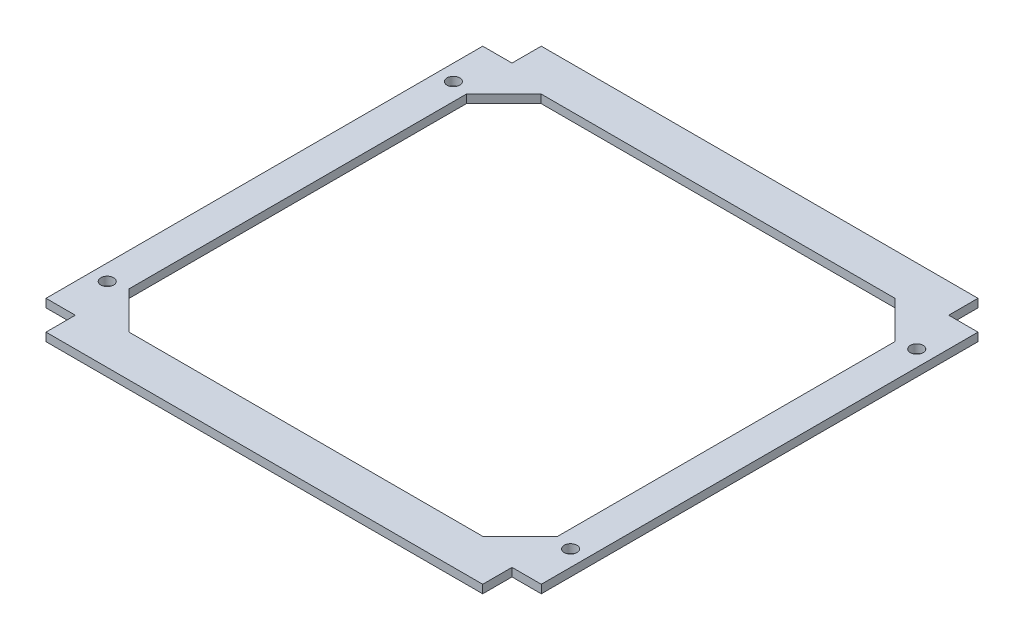
ISO-10303-21;
HEADER;
FILE_DESCRIPTION(('STEP AP214'),'2;1');
FILE_NAME('part.step','',(''),(''),'','','');
FILE_SCHEMA(('AUTOMOTIVE_DESIGN { 1 0 10303 214 1 1 1 1 }'));
ENDSEC;
DATA;
#1=APPLICATION_CONTEXT('core data for automotive mechanical design processes');
#2=APPLICATION_PROTOCOL_DEFINITION('international standard','automotive_design',2000,#1);
#3=PRODUCT_CONTEXT('',#1,'mechanical');
#4=PRODUCT('Part','Part','',(#3));
#5=PRODUCT_RELATED_PRODUCT_CATEGORY('part','',(#4));
#6=PRODUCT_DEFINITION_FORMATION('','',#4);
#7=PRODUCT_DEFINITION_CONTEXT('part definition',#1,'design');
#8=PRODUCT_DEFINITION('design','',#6,#7);
#9=PRODUCT_DEFINITION_SHAPE('','',#8);
#10=(LENGTH_UNIT() NAMED_UNIT(*) SI_UNIT(.MILLI.,.METRE.));
#11=(NAMED_UNIT(*) PLANE_ANGLE_UNIT() SI_UNIT($,.RADIAN.));
#12=(NAMED_UNIT(*) SI_UNIT($,.STERADIAN.) SOLID_ANGLE_UNIT());
#13=UNCERTAINTY_MEASURE_WITH_UNIT(LENGTH_MEASURE(1.E-05),#10,'distance_accuracy_value','');
#14=(GEOMETRIC_REPRESENTATION_CONTEXT(3) GLOBAL_UNCERTAINTY_ASSIGNED_CONTEXT((#13)) GLOBAL_UNIT_ASSIGNED_CONTEXT((#10,
#11,#12)) REPRESENTATION_CONTEXT('',''));
#15=CARTESIAN_POINT('',(0.,0.,0.));
#16=DIRECTION('',(0.,0.,1.));
#17=DIRECTION('',(1.,0.,0.));
#18=AXIS2_PLACEMENT_3D('',#15,#16,#17);
#19=CARTESIAN_POINT('',(-41.,1.56,41.));
#20=DIRECTION('',(1.,0.,0.));
#21=DIRECTION('',(0.,0.,-1.));
#22=AXIS2_PLACEMENT_3D('',#19,#20,#21);
#23=PLANE('',#22);
#24=DIRECTION('',(0.,0.,1.));
#25=VECTOR('',#24,1.);
#26=CARTESIAN_POINT('',(-41.,0.,41.));
#27=LINE('',#26,#25);
#28=CARTESIAN_POINT('',(-41.,0.,41.));
#29=VERTEX_POINT('',#28);
#30=CARTESIAN_POINT('',(-41.,0.,46.5));
#31=VERTEX_POINT('',#30);
#32=EDGE_CURVE('E230',#29,#31,#27,.T.);
#33=ORIENTED_EDGE('',*,*,#32,.T.);
#34=DIRECTION('',(0.,-1.,0.));
#35=VECTOR('',#34,1.);
#36=CARTESIAN_POINT('',(-41.,1.56,46.5));
#37=LINE('',#36,#35);
#38=CARTESIAN_POINT('',(-41.,1.56,46.5));
#39=VERTEX_POINT('',#38);
#40=EDGE_CURVE('E11',#39,#31,#37,.T.);
#41=ORIENTED_EDGE('',*,*,#40,.F.);
#42=DIRECTION('',(0.,0.,1.));
#43=VECTOR('',#42,1.);
#44=CARTESIAN_POINT('',(-41.,1.56,41.));
#45=LINE('',#44,#43);
#46=CARTESIAN_POINT('',(-41.,1.56,41.));
#47=VERTEX_POINT('',#46);
#48=EDGE_CURVE('E242',#47,#39,#45,.T.);
#49=ORIENTED_EDGE('',*,*,#48,.F.);
#50=DIRECTION('',(0.,-1.,0.));
#51=VECTOR('',#50,1.);
#52=CARTESIAN_POINT('',(-41.,1.56,41.));
#53=LINE('',#52,#51);
#54=EDGE_CURVE('E268',#47,#29,#53,.T.);
#55=ORIENTED_EDGE('',*,*,#54,.T.);
#56=EDGE_LOOP('',(#33,#41,#49,#55));
#57=FACE_BOUND('',#56,.T.);
#58=ADVANCED_FACE('F34',(#57),#23,.F.);
#59=CARTESIAN_POINT('',(41.0000000000006,1.56,46.5000000000004));
#60=DIRECTION('',(0.,0.,-1.));
#61=DIRECTION('',(-1.,0.,0.));
#62=AXIS2_PLACEMENT_3D('',#59,#60,#61);
#63=PLANE('',#62);
#64=DIRECTION('',(1.,0.,0.));
#65=VECTOR('',#64,1.);
#66=CARTESIAN_POINT('',(41.0000000000006,0.,46.5000000000004));
#67=LINE('',#66,#65);
#68=CARTESIAN_POINT('',(41.0000000000006,0.,46.5000000000004));
#69=VERTEX_POINT('',#68);
#70=EDGE_CURVE('E271',#31,#69,#67,.T.);
#71=ORIENTED_EDGE('',*,*,#70,.T.);
#72=DIRECTION('',(0.,-1.,0.));
#73=VECTOR('',#72,1.);
#74=CARTESIAN_POINT('',(41.0000000000006,1.56,46.5000000000004));
#75=LINE('',#74,#73);
#76=CARTESIAN_POINT('',(41.0000000000006,1.56,46.5000000000004));
#77=VERTEX_POINT('',#76);
#78=EDGE_CURVE('E41',#77,#69,#75,.T.);
#79=ORIENTED_EDGE('',*,*,#78,.F.);
#80=DIRECTION('',(1.,0.,0.));
#81=VECTOR('',#80,1.);
#82=CARTESIAN_POINT('',(41.0000000000006,1.56,46.5000000000004));
#83=LINE('',#82,#81);
#84=EDGE_CURVE('E245',#39,#77,#83,.T.);
#85=ORIENTED_EDGE('',*,*,#84,.F.);
#86=ORIENTED_EDGE('',*,*,#40,.T.);
#87=EDGE_LOOP('',(#71,#79,#85,#86));
#88=FACE_BOUND('',#87,.T.);
#89=ADVANCED_FACE('F346',(#88),#63,.F.);
#90=CARTESIAN_POINT('',(41.0000000000006,1.56,41.));
#91=DIRECTION('',(-1.,0.,0.));
#92=DIRECTION('',(0.,0.,1.));
#93=AXIS2_PLACEMENT_3D('',#90,#91,#92);
#94=PLANE('',#93);
#95=DIRECTION('',(0.,0.,-1.));
#96=VECTOR('',#95,1.);
#97=CARTESIAN_POINT('',(41.0000000000006,0.,41.));
#98=LINE('',#97,#96);
#99=CARTESIAN_POINT('',(41.0000000000006,0.,41.));
#100=VERTEX_POINT('',#99);
#101=EDGE_CURVE('E273',#69,#100,#98,.T.);
#102=ORIENTED_EDGE('',*,*,#101,.T.);
#103=DIRECTION('',(0.,-1.,0.));
#104=VECTOR('',#103,1.);
#105=CARTESIAN_POINT('',(41.0000000000006,1.56,41.));
#106=LINE('',#105,#104);
#107=CARTESIAN_POINT('',(41.0000000000006,1.56,41.));
#108=VERTEX_POINT('',#107);
#109=EDGE_CURVE('E318',#108,#100,#106,.T.);
#110=ORIENTED_EDGE('',*,*,#109,.F.);
#111=DIRECTION('',(0.,0.,-1.));
#112=VECTOR('',#111,1.);
#113=CARTESIAN_POINT('',(41.0000000000006,1.56,41.));
#114=LINE('',#113,#112);
#115=EDGE_CURVE('E248',#77,#108,#114,.T.);
#116=ORIENTED_EDGE('',*,*,#115,.F.);
#117=ORIENTED_EDGE('',*,*,#78,.T.);
#118=EDGE_LOOP('',(#102,#110,#116,#117));
#119=FACE_BOUND('',#118,.T.);
#120=ADVANCED_FACE('F325',(#119),#94,.F.);
#121=CARTESIAN_POINT('',(41.0000000000006,1.56,41.));
#122=DIRECTION('',(0.,0.,-1.));
#123=DIRECTION('',(-1.,0.,0.));
#124=AXIS2_PLACEMENT_3D('',#121,#122,#123);
#125=PLANE('',#124);
#126=DIRECTION('',(1.,0.,0.));
#127=VECTOR('',#126,1.);
#128=CARTESIAN_POINT('',(41.0000000000006,0.,41.));
#129=LINE('',#128,#127);
#130=CARTESIAN_POINT('',(46.5000000000006,0.,41.));
#131=VERTEX_POINT('',#130);
#132=EDGE_CURVE('E275',#100,#131,#129,.T.);
#133=ORIENTED_EDGE('',*,*,#132,.T.);
#134=DIRECTION('',(0.,-1.,0.));
#135=VECTOR('',#134,1.);
#136=CARTESIAN_POINT('',(46.5000000000006,1.56,41.));
#137=LINE('',#136,#135);
#138=CARTESIAN_POINT('',(46.5000000000006,1.56,41.));
#139=VERTEX_POINT('',#138);
#140=EDGE_CURVE('E315',#139,#131,#137,.T.);
#141=ORIENTED_EDGE('',*,*,#140,.F.);
#142=DIRECTION('',(1.,0.,0.));
#143=VECTOR('',#142,1.);
#144=CARTESIAN_POINT('',(41.0000000000006,1.56,41.));
#145=LINE('',#144,#143);
#146=EDGE_CURVE('E250',#108,#139,#145,.T.);
#147=ORIENTED_EDGE('',*,*,#146,.F.);
#148=ORIENTED_EDGE('',*,*,#109,.T.);
#149=EDGE_LOOP('',(#133,#141,#147,#148));
#150=FACE_BOUND('',#149,.T.);
#151=ADVANCED_FACE('F334',(#150),#125,.F.);
#152=CARTESIAN_POINT('',(46.5000000000006,1.56,41.));
#153=DIRECTION('',(-1.,0.,0.));
#154=DIRECTION('',(0.,0.,1.));
#155=AXIS2_PLACEMENT_3D('',#152,#153,#154);
#156=PLANE('',#155);
#157=DIRECTION('',(0.,0.,-1.));
#158=VECTOR('',#157,1.);
#159=CARTESIAN_POINT('',(46.5000000000006,0.,41.));
#160=LINE('',#159,#158);
#161=CARTESIAN_POINT('',(46.5000000000003,0.,-40.9999999999997));
#162=VERTEX_POINT('',#161);
#163=EDGE_CURVE('E277',#131,#162,#160,.T.);
#164=ORIENTED_EDGE('',*,*,#163,.T.);
#165=DIRECTION('',(0.,-1.,0.));
#166=VECTOR('',#165,1.);
#167=CARTESIAN_POINT('',(46.5000000000003,1.56,-40.9999999999997));
#168=LINE('',#167,#166);
#169=CARTESIAN_POINT('',(46.5000000000003,1.56,-40.9999999999997));
#170=VERTEX_POINT('',#169);
#171=EDGE_CURVE('E312',#170,#162,#168,.T.);
#172=ORIENTED_EDGE('',*,*,#171,.F.);
#173=DIRECTION('',(0.,0.,-1.));
#174=VECTOR('',#173,1.);
#175=CARTESIAN_POINT('',(46.5000000000006,1.56,41.));
#176=LINE('',#175,#174);
#177=EDGE_CURVE('E252',#139,#170,#176,.T.);
#178=ORIENTED_EDGE('',*,*,#177,.F.);
#179=ORIENTED_EDGE('',*,*,#140,.T.);
#180=EDGE_LOOP('',(#164,#172,#178,#179));
#181=FACE_BOUND('',#180,.T.);
#182=ADVANCED_FACE('F338',(#181),#156,.F.);
#183=CARTESIAN_POINT('',(41.0000000000003,1.56,-40.9999999999997));
#184=DIRECTION('',(0.,0.,1.));
#185=DIRECTION('',(1.,0.,0.));
#186=AXIS2_PLACEMENT_3D('',#183,#184,#185);
#187=PLANE('',#186);
#188=DIRECTION('',(-1.,0.,0.));
#189=VECTOR('',#188,1.);
#190=CARTESIAN_POINT('',(41.0000000000003,0.,-40.9999999999997));
#191=LINE('',#190,#189);
#192=CARTESIAN_POINT('',(41.0000000000003,0.,-40.9999999999997));
#193=VERTEX_POINT('',#192);
#194=EDGE_CURVE('E279',#162,#193,#191,.T.);
#195=ORIENTED_EDGE('',*,*,#194,.T.);
#196=DIRECTION('',(0.,-1.,0.));
#197=VECTOR('',#196,1.);
#198=CARTESIAN_POINT('',(41.0000000000003,1.56,-40.9999999999997));
#199=LINE('',#198,#197);
#200=CARTESIAN_POINT('',(41.0000000000003,1.56,-40.9999999999997));
#201=VERTEX_POINT('',#200);
#202=EDGE_CURVE('E309',#201,#193,#199,.T.);
#203=ORIENTED_EDGE('',*,*,#202,.F.);
#204=DIRECTION('',(-1.,0.,0.));
#205=VECTOR('',#204,1.);
#206=CARTESIAN_POINT('',(41.0000000000003,1.56,-40.9999999999997));
#207=LINE('',#206,#205);
#208=EDGE_CURVE('E254',#170,#201,#207,.T.);
#209=ORIENTED_EDGE('',*,*,#208,.F.);
#210=ORIENTED_EDGE('',*,*,#171,.T.);
#211=EDGE_LOOP('',(#195,#203,#209,#210));
#212=FACE_BOUND('',#211,.T.);
#213=ADVANCED_FACE('F379',(#212),#187,.F.);
#214=CARTESIAN_POINT('',(41.0000000000003,1.56,-40.9999999999997));
#215=DIRECTION('',(-1.,0.,0.));
#216=DIRECTION('',(0.,0.,1.));
#217=AXIS2_PLACEMENT_3D('',#214,#215,#216);
#218=PLANE('',#217);
#219=DIRECTION('',(0.,0.,-1.));
#220=VECTOR('',#219,1.);
#221=CARTESIAN_POINT('',(41.0000000000003,0.,-40.9999999999997));
#222=LINE('',#221,#220);
#223=CARTESIAN_POINT('',(41.0000000000003,0.,-46.4999999999997));
#224=VERTEX_POINT('',#223);
#225=EDGE_CURVE('E281',#193,#224,#222,.T.);
#226=ORIENTED_EDGE('',*,*,#225,.T.);
#227=DIRECTION('',(0.,-1.,0.));
#228=VECTOR('',#227,1.);
#229=CARTESIAN_POINT('',(41.0000000000003,1.56,-46.4999999999997));
#230=LINE('',#229,#228);
#231=CARTESIAN_POINT('',(41.0000000000003,1.56,-46.4999999999997));
#232=VERTEX_POINT('',#231);
#233=EDGE_CURVE('E306',#232,#224,#230,.T.);
#234=ORIENTED_EDGE('',*,*,#233,.F.);
#235=DIRECTION('',(0.,0.,-1.));
#236=VECTOR('',#235,1.);
#237=CARTESIAN_POINT('',(41.0000000000003,1.56,-40.9999999999997));
#238=LINE('',#237,#236);
#239=EDGE_CURVE('E256',#201,#232,#238,.T.);
#240=ORIENTED_EDGE('',*,*,#239,.F.);
#241=ORIENTED_EDGE('',*,*,#202,.T.);
#242=EDGE_LOOP('',(#226,#234,#240,#241));
#243=FACE_BOUND('',#242,.T.);
#244=ADVANCED_FACE('F377',(#243),#218,.F.);
#245=CARTESIAN_POINT('',(41.0000000000003,1.56,-46.4999999999997));
#246=DIRECTION('',(0.,0.,1.));
#247=DIRECTION('',(1.,0.,0.));
#248=AXIS2_PLACEMENT_3D('',#245,#246,#247);
#249=PLANE('',#248);
#250=DIRECTION('',(-1.,0.,0.));
#251=VECTOR('',#250,1.);
#252=CARTESIAN_POINT('',(41.0000000000003,0.,-46.4999999999997));
#253=LINE('',#252,#251);
#254=CARTESIAN_POINT('',(-40.9999999999999,0.,-46.5000000000001));
#255=VERTEX_POINT('',#254);
#256=EDGE_CURVE('E283',#224,#255,#253,.T.);
#257=ORIENTED_EDGE('',*,*,#256,.T.);
#258=DIRECTION('',(0.,-1.,0.));
#259=VECTOR('',#258,1.);
#260=CARTESIAN_POINT('',(-40.9999999999999,1.56,-46.5000000000001));
#261=LINE('',#260,#259);
#262=CARTESIAN_POINT('',(-40.9999999999999,1.56,-46.5000000000001));
#263=VERTEX_POINT('',#262);
#264=EDGE_CURVE('E303',#263,#255,#261,.T.);
#265=ORIENTED_EDGE('',*,*,#264,.F.);
#266=DIRECTION('',(-1.,0.,0.));
#267=VECTOR('',#266,1.);
#268=CARTESIAN_POINT('',(41.0000000000003,1.56,-46.4999999999997));
#269=LINE('',#268,#267);
#270=EDGE_CURVE('E258',#232,#263,#269,.T.);
#271=ORIENTED_EDGE('',*,*,#270,.F.);
#272=ORIENTED_EDGE('',*,*,#233,.T.);
#273=EDGE_LOOP('',(#257,#265,#271,#272));
#274=FACE_BOUND('',#273,.T.);
#275=ADVANCED_FACE('F373',(#274),#249,.F.);
#276=CARTESIAN_POINT('',(-40.9999999999999,1.56,-41.0000000000001));
#277=DIRECTION('',(1.,0.,0.));
#278=DIRECTION('',(0.,0.,-1.));
#279=AXIS2_PLACEMENT_3D('',#276,#277,#278);
#280=PLANE('',#279);
#281=DIRECTION('',(0.,0.,1.));
#282=VECTOR('',#281,1.);
#283=CARTESIAN_POINT('',(-40.9999999999999,0.,-41.0000000000001));
#284=LINE('',#283,#282);
#285=CARTESIAN_POINT('',(-40.9999999999999,0.,-41.0000000000001));
#286=VERTEX_POINT('',#285);
#287=EDGE_CURVE('E285',#255,#286,#284,.T.);
#288=ORIENTED_EDGE('',*,*,#287,.T.);
#289=DIRECTION('',(0.,-1.,0.));
#290=VECTOR('',#289,1.);
#291=CARTESIAN_POINT('',(-40.9999999999999,1.56,-41.0000000000001));
#292=LINE('',#291,#290);
#293=CARTESIAN_POINT('',(-40.9999999999999,1.56,-41.0000000000001));
#294=VERTEX_POINT('',#293);
#295=EDGE_CURVE('E300',#294,#286,#292,.T.);
#296=ORIENTED_EDGE('',*,*,#295,.F.);
#297=DIRECTION('',(0.,0.,1.));
#298=VECTOR('',#297,1.);
#299=CARTESIAN_POINT('',(-40.9999999999999,1.56,-41.0000000000001));
#300=LINE('',#299,#298);
#301=EDGE_CURVE('E260',#263,#294,#300,.T.);
#302=ORIENTED_EDGE('',*,*,#301,.F.);
#303=ORIENTED_EDGE('',*,*,#264,.T.);
#304=EDGE_LOOP('',(#288,#296,#302,#303));
#305=FACE_BOUND('',#304,.T.);
#306=ADVANCED_FACE('F368',(#305),#280,.F.);
#307=CARTESIAN_POINT('',(-40.9999999999999,1.56,-41.0000000000001));
#308=DIRECTION('',(0.,0.,1.));
#309=DIRECTION('',(1.,0.,0.));
#310=AXIS2_PLACEMENT_3D('',#307,#308,#309);
#311=PLANE('',#310);
#312=DIRECTION('',(-1.,0.,0.));
#313=VECTOR('',#312,1.);
#314=CARTESIAN_POINT('',(-40.9999999999999,0.,-41.0000000000001));
#315=LINE('',#314,#313);
#316=CARTESIAN_POINT('',(-46.4999999999999,0.,-41.0000000000001));
#317=VERTEX_POINT('',#316);
#318=EDGE_CURVE('E287',#286,#317,#315,.T.);
#319=ORIENTED_EDGE('',*,*,#318,.T.);
#320=DIRECTION('',(0.,-1.,0.));
#321=VECTOR('',#320,1.);
#322=CARTESIAN_POINT('',(-46.4999999999999,1.56,-41.0000000000001));
#323=LINE('',#322,#321);
#324=CARTESIAN_POINT('',(-46.4999999999999,1.56,-41.0000000000001));
#325=VERTEX_POINT('',#324);
#326=EDGE_CURVE('E297',#325,#317,#323,.T.);
#327=ORIENTED_EDGE('',*,*,#326,.F.);
#328=DIRECTION('',(-1.,0.,0.));
#329=VECTOR('',#328,1.);
#330=CARTESIAN_POINT('',(-40.9999999999999,1.56,-41.0000000000001));
#331=LINE('',#330,#329);
#332=EDGE_CURVE('E262',#294,#325,#331,.T.);
#333=ORIENTED_EDGE('',*,*,#332,.F.);
#334=ORIENTED_EDGE('',*,*,#295,.T.);
#335=EDGE_LOOP('',(#319,#327,#333,#334));
#336=FACE_BOUND('',#335,.T.);
#337=ADVANCED_FACE('F362',(#336),#311,.F.);
#338=CARTESIAN_POINT('',(-46.5,1.56,41.));
#339=DIRECTION('',(1.,0.,0.));
#340=DIRECTION('',(0.,0.,-1.));
#341=AXIS2_PLACEMENT_3D('',#338,#339,#340);
#342=PLANE('',#341);
#343=DIRECTION('',(0.,0.,1.));
#344=VECTOR('',#343,1.);
#345=CARTESIAN_POINT('',(-46.5,0.,41.));
#346=LINE('',#345,#344);
#347=CARTESIAN_POINT('',(-46.5,0.,41.));
#348=VERTEX_POINT('',#347);
#349=EDGE_CURVE('E289',#317,#348,#346,.T.);
#350=ORIENTED_EDGE('',*,*,#349,.T.);
#351=DIRECTION('',(0.,-1.,0.));
#352=VECTOR('',#351,1.);
#353=CARTESIAN_POINT('',(-46.5,1.56,41.));
#354=LINE('',#353,#352);
#355=CARTESIAN_POINT('',(-46.5,1.56,41.));
#356=VERTEX_POINT('',#355);
#357=EDGE_CURVE('E294',#356,#348,#354,.T.);
#358=ORIENTED_EDGE('',*,*,#357,.F.);
#359=DIRECTION('',(0.,0.,1.));
#360=VECTOR('',#359,1.);
#361=CARTESIAN_POINT('',(-46.5,1.56,41.));
#362=LINE('',#361,#360);
#363=EDGE_CURVE('E264',#325,#356,#362,.T.);
#364=ORIENTED_EDGE('',*,*,#363,.F.);
#365=ORIENTED_EDGE('',*,*,#326,.T.);
#366=EDGE_LOOP('',(#350,#358,#364,#365));
#367=FACE_BOUND('',#366,.T.);
#368=ADVANCED_FACE('F358',(#367),#342,.F.);
#369=CARTESIAN_POINT('',(-41.,1.56,41.));
#370=DIRECTION('',(0.,0.,-1.));
#371=DIRECTION('',(-1.,0.,0.));
#372=AXIS2_PLACEMENT_3D('',#369,#370,#371);
#373=PLANE('',#372);
#374=DIRECTION('',(1.,0.,0.));
#375=VECTOR('',#374,1.);
#376=CARTESIAN_POINT('',(-41.,0.,41.));
#377=LINE('',#376,#375);
#378=EDGE_CURVE('E246',#348,#29,#377,.T.);
#379=ORIENTED_EDGE('',*,*,#378,.T.);
#380=ORIENTED_EDGE('',*,*,#54,.F.);
#381=DIRECTION('',(1.,0.,0.));
#382=VECTOR('',#381,1.);
#383=CARTESIAN_POINT('',(-41.,1.56,41.));
#384=LINE('',#383,#382);
#385=EDGE_CURVE('E266',#356,#47,#384,.T.);
#386=ORIENTED_EDGE('',*,*,#385,.F.);
#387=ORIENTED_EDGE('',*,*,#357,.T.);
#388=EDGE_LOOP('',(#379,#380,#386,#387));
#389=FACE_BOUND('',#388,.T.);
#390=ADVANCED_FACE('F353',(#389),#373,.F.);
#391=CARTESIAN_POINT('',(0.,1.56,0.));
#392=DIRECTION('',(0.,-1.,0.));
#393=DIRECTION('',(0.,0.,-1.));
#394=AXIS2_PLACEMENT_3D('',#391,#392,#393);
#395=PLANE('',#394);
#396=CARTESIAN_POINT('',(-43.5,1.56,32.5));
#397=DIRECTION('',(0.,1.,0.));
#398=DIRECTION('',(0.,0.,1.));
#399=AXIS2_PLACEMENT_3D('',#396,#397,#398);
#400=CIRCLE('',#399,1.19999999999999);
#401=CARTESIAN_POINT('',(-43.5,1.56,33.7));
#402=VERTEX_POINT('',#401);
#403=EDGE_CURVE('E601',#402,#402,#400,.T.);
#404=ORIENTED_EDGE('',*,*,#403,.F.);
#405=EDGE_LOOP('',(#404));
#406=FACE_BOUND('',#405,.T.);
#407=CARTESIAN_POINT('',(-43.5,1.56,-32.5));
#408=DIRECTION('',(0.,1.,0.));
#409=DIRECTION('',(0.,0.,1.));
#410=AXIS2_PLACEMENT_3D('',#407,#408,#409);
#411=CIRCLE('',#410,1.19999999999999);
#412=CARTESIAN_POINT('',(-43.5,1.56,-31.3));
#413=VERTEX_POINT('',#412);
#414=EDGE_CURVE('E603',#413,#413,#411,.T.);
#415=ORIENTED_EDGE('',*,*,#414,.F.);
#416=EDGE_LOOP('',(#415));
#417=FACE_BOUND('',#416,.T.);
#418=CARTESIAN_POINT('',(43.5,1.56,-32.5));
#419=DIRECTION('',(0.,1.,0.));
#420=DIRECTION('',(0.,0.,1.));
#421=AXIS2_PLACEMENT_3D('',#418,#419,#420);
#422=CIRCLE('',#421,1.19999999999999);
#423=CARTESIAN_POINT('',(43.5,1.56,-31.3));
#424=VERTEX_POINT('',#423);
#425=EDGE_CURVE('E611',#424,#424,#422,.T.);
#426=ORIENTED_EDGE('',*,*,#425,.F.);
#427=EDGE_LOOP('',(#426));
#428=FACE_BOUND('',#427,.T.);
#429=CARTESIAN_POINT('',(43.5,1.56,32.5));
#430=DIRECTION('',(0.,1.,0.));
#431=DIRECTION('',(0.,0.,1.));
#432=AXIS2_PLACEMENT_3D('',#429,#430,#431);
#433=CIRCLE('',#432,1.19999999999999);
#434=CARTESIAN_POINT('',(43.5,1.56,33.7));
#435=VERTEX_POINT('',#434);
#436=EDGE_CURVE('E616',#435,#435,#433,.T.);
#437=ORIENTED_EDGE('',*,*,#436,.F.);
#438=EDGE_LOOP('',(#437));
#439=FACE_BOUND('',#438,.T.);
#440=DIRECTION('',(0.707106781186547,0.,0.707106781186547));
#441=VECTOR('',#440,1.);
#442=CARTESIAN_POINT('',(-33.2433148037248,1.56,38.7047880243918));
#443=LINE('',#442,#441);
#444=CARTESIAN_POINT('',(-40.2433148037248,1.56,31.7047880243918));
#445=VERTEX_POINT('',#444);
#446=CARTESIAN_POINT('',(-33.2433148037248,1.56,38.7047880243918));
#447=VERTEX_POINT('',#446);
#448=EDGE_CURVE('E212',#445,#447,#443,.T.);
#449=ORIENTED_EDGE('',*,*,#448,.F.);
#450=DIRECTION('',(0.,0.,1.));
#451=VECTOR('',#450,1.);
#452=CARTESIAN_POINT('',(-40.2433148037248,1.56,31.7047880243918));
#453=LINE('',#452,#451);
#454=CARTESIAN_POINT('',(-40.2433148037248,1.56,-31.7047880243918));
#455=VERTEX_POINT('',#454);
#456=EDGE_CURVE('E48',#455,#445,#453,.T.);
#457=ORIENTED_EDGE('',*,*,#456,.F.);
#458=DIRECTION('',(-0.707106781186547,0.,0.707106781186547));
#459=VECTOR('',#458,1.);
#460=CARTESIAN_POINT('',(-40.2433148037248,1.56,-31.7047880243918));
#461=LINE('',#460,#459);
#462=CARTESIAN_POINT('',(-33.2433148037248,1.56,-38.7047880243918));
#463=VERTEX_POINT('',#462);
#464=EDGE_CURVE('E189',#463,#455,#461,.T.);
#465=ORIENTED_EDGE('',*,*,#464,.F.);
#466=DIRECTION('',(-1.,0.,0.));
#467=VECTOR('',#466,1.);
#468=CARTESIAN_POINT('',(33.2433148037248,1.56,-38.7047880243918));
#469=LINE('',#468,#467);
#470=CARTESIAN_POINT('',(33.2433148037248,1.56,-38.7047880243918));
#471=VERTEX_POINT('',#470);
#472=EDGE_CURVE('E192',#471,#463,#469,.T.);
#473=ORIENTED_EDGE('',*,*,#472,.F.);
#474=DIRECTION('',(-0.707106781186547,0.,-0.707106781186547));
#475=VECTOR('',#474,1.);
#476=CARTESIAN_POINT('',(40.2433148037248,1.56,-31.7047880243918));
#477=LINE('',#476,#475);
#478=CARTESIAN_POINT('',(40.2433148037248,1.56,-31.7047880243918));
#479=VERTEX_POINT('',#478);
#480=EDGE_CURVE('E223',#479,#471,#477,.T.);
#481=ORIENTED_EDGE('',*,*,#480,.F.);
#482=DIRECTION('',(0.,0.,-1.));
#483=VECTOR('',#482,1.);
#484=CARTESIAN_POINT('',(40.2433148037248,1.56,31.7047880243918));
#485=LINE('',#484,#483);
#486=CARTESIAN_POINT('',(40.2433148037248,1.56,31.7047880243918));
#487=VERTEX_POINT('',#486);
#488=EDGE_CURVE('E220',#487,#479,#485,.T.);
#489=ORIENTED_EDGE('',*,*,#488,.F.);
#490=DIRECTION('',(0.707106781186547,0.,-0.707106781186547));
#491=VECTOR('',#490,1.);
#492=CARTESIAN_POINT('',(33.2433148037248,1.56,38.7047880243918));
#493=LINE('',#492,#491);
#494=CARTESIAN_POINT('',(33.2433148037248,1.56,38.7047880243918));
#495=VERTEX_POINT('',#494);
#496=EDGE_CURVE('E217',#495,#487,#493,.T.);
#497=ORIENTED_EDGE('',*,*,#496,.F.);
#498=DIRECTION('',(1.,0.,0.));
#499=VECTOR('',#498,1.);
#500=CARTESIAN_POINT('',(33.2433148037248,1.56,38.7047880243918));
#501=LINE('',#500,#499);
#502=EDGE_CURVE('E214',#447,#495,#501,.T.);
#503=ORIENTED_EDGE('',*,*,#502,.F.);
#504=EDGE_LOOP('',(#449,#457,#465,#473,#481,#489,#497,#503));
#505=FACE_BOUND('',#504,.T.);
#506=ORIENTED_EDGE('',*,*,#48,.T.);
#507=ORIENTED_EDGE('',*,*,#84,.T.);
#508=ORIENTED_EDGE('',*,*,#115,.T.);
#509=ORIENTED_EDGE('',*,*,#146,.T.);
#510=ORIENTED_EDGE('',*,*,#177,.T.);
#511=ORIENTED_EDGE('',*,*,#208,.T.);
#512=ORIENTED_EDGE('',*,*,#239,.T.);
#513=ORIENTED_EDGE('',*,*,#270,.T.);
#514=ORIENTED_EDGE('',*,*,#301,.T.);
#515=ORIENTED_EDGE('',*,*,#332,.T.);
#516=ORIENTED_EDGE('',*,*,#363,.T.);
#517=ORIENTED_EDGE('',*,*,#385,.T.);
#518=EDGE_LOOP('',(#506,#507,#508,#509,#510,#511,#512,#513,#514,#515,#516,#517));
#519=FACE_BOUND('',#518,.T.);
#520=ADVANCED_FACE('F342',(#406,#417,#428,#439,#505,#519),#395,.F.);
#521=CARTESIAN_POINT('',(0.,0.,0.));
#522=DIRECTION('',(0.,-1.,0.));
#523=DIRECTION('',(0.,0.,-1.));
#524=AXIS2_PLACEMENT_3D('',#521,#522,#523);
#525=PLANE('',#524);
#526=CARTESIAN_POINT('',(-43.5,0.,32.5));
#527=DIRECTION('',(0.,-1.,0.));
#528=DIRECTION('',(0.,0.,-1.));
#529=AXIS2_PLACEMENT_3D('',#526,#527,#528);
#530=CIRCLE('',#529,1.19999999999999);
#531=CARTESIAN_POINT('',(-43.5,0.,31.3));
#532=VERTEX_POINT('',#531);
#533=EDGE_CURVE('E598',#532,#532,#530,.T.);
#534=ORIENTED_EDGE('',*,*,#533,.F.);
#535=EDGE_LOOP('',(#534));
#536=FACE_BOUND('',#535,.T.);
#537=CARTESIAN_POINT('',(-43.5,0.,-32.5));
#538=DIRECTION('',(0.,-1.,0.));
#539=DIRECTION('',(0.,0.,-1.));
#540=AXIS2_PLACEMENT_3D('',#537,#538,#539);
#541=CIRCLE('',#540,1.19999999999999);
#542=CARTESIAN_POINT('',(-43.5,0.,-33.7));
#543=VERTEX_POINT('',#542);
#544=EDGE_CURVE('E608',#543,#543,#541,.T.);
#545=ORIENTED_EDGE('',*,*,#544,.F.);
#546=EDGE_LOOP('',(#545));
#547=FACE_BOUND('',#546,.T.);
#548=CARTESIAN_POINT('',(43.5,0.,-32.5));
#549=DIRECTION('',(0.,-1.,0.));
#550=DIRECTION('',(0.,0.,-1.));
#551=AXIS2_PLACEMENT_3D('',#548,#549,#550);
#552=CIRCLE('',#551,1.19999999999999);
#553=CARTESIAN_POINT('',(43.5,0.,-33.7));
#554=VERTEX_POINT('',#553);
#555=EDGE_CURVE('E614',#554,#554,#552,.T.);
#556=ORIENTED_EDGE('',*,*,#555,.F.);
#557=EDGE_LOOP('',(#556));
#558=FACE_BOUND('',#557,.T.);
#559=CARTESIAN_POINT('',(43.5,0.,32.5));
#560=DIRECTION('',(0.,-1.,0.));
#561=DIRECTION('',(0.,0.,-1.));
#562=AXIS2_PLACEMENT_3D('',#559,#560,#561);
#563=CIRCLE('',#562,1.19999999999999);
#564=CARTESIAN_POINT('',(43.5,0.,31.3));
#565=VERTEX_POINT('',#564);
#566=EDGE_CURVE('E195',#565,#565,#563,.T.);
#567=ORIENTED_EDGE('',*,*,#566,.F.);
#568=EDGE_LOOP('',(#567));
#569=FACE_BOUND('',#568,.T.);
#570=DIRECTION('',(0.,0.,1.));
#571=VECTOR('',#570,1.);
#572=CARTESIAN_POINT('',(-40.2433148037248,0.,31.7047880243918));
#573=LINE('',#572,#571);
#574=CARTESIAN_POINT('',(-40.2433148037248,0.,-31.7047880243918));
#575=VERTEX_POINT('',#574);
#576=CARTESIAN_POINT('',(-40.2433148037248,0.,31.7047880243918));
#577=VERTEX_POINT('',#576);
#578=EDGE_CURVE('E172',#575,#577,#573,.T.);
#579=ORIENTED_EDGE('',*,*,#578,.T.);
#580=DIRECTION('',(0.707106781186547,0.,0.707106781186547));
#581=VECTOR('',#580,1.);
#582=CARTESIAN_POINT('',(-33.2433148037248,0.,38.7047880243918));
#583=LINE('',#582,#581);
#584=CARTESIAN_POINT('',(-33.2433148037248,0.,38.7047880243918));
#585=VERTEX_POINT('',#584);
#586=EDGE_CURVE('E181',#577,#585,#583,.T.);
#587=ORIENTED_EDGE('',*,*,#586,.T.);
#588=DIRECTION('',(1.,0.,0.));
#589=VECTOR('',#588,1.);
#590=CARTESIAN_POINT('',(33.2433148037248,0.,38.7047880243918));
#591=LINE('',#590,#589);
#592=CARTESIAN_POINT('',(33.2433148037248,0.,38.7047880243918));
#593=VERTEX_POINT('',#592);
#594=EDGE_CURVE('E56',#585,#593,#591,.T.);
#595=ORIENTED_EDGE('',*,*,#594,.T.);
#596=DIRECTION('',(0.707106781186547,0.,-0.707106781186547));
#597=VECTOR('',#596,1.);
#598=CARTESIAN_POINT('',(33.2433148037248,0.,38.7047880243918));
#599=LINE('',#598,#597);
#600=CARTESIAN_POINT('',(40.2433148037248,0.,31.7047880243918));
#601=VERTEX_POINT('',#600);
#602=EDGE_CURVE('E199',#593,#601,#599,.T.);
#603=ORIENTED_EDGE('',*,*,#602,.T.);
#604=DIRECTION('',(0.,0.,-1.));
#605=VECTOR('',#604,1.);
#606=CARTESIAN_POINT('',(40.2433148037248,0.,31.7047880243918));
#607=LINE('',#606,#605);
#608=CARTESIAN_POINT('',(40.2433148037248,0.,-31.7047880243918));
#609=VERTEX_POINT('',#608);
#610=EDGE_CURVE('E202',#601,#609,#607,.T.);
#611=ORIENTED_EDGE('',*,*,#610,.T.);
#612=DIRECTION('',(-0.707106781186547,0.,-0.707106781186547));
#613=VECTOR('',#612,1.);
#614=CARTESIAN_POINT('',(40.2433148037248,0.,-31.7047880243918));
#615=LINE('',#614,#613);
#616=CARTESIAN_POINT('',(33.2433148037248,0.,-38.7047880243918));
#617=VERTEX_POINT('',#616);
#618=EDGE_CURVE('E205',#609,#617,#615,.T.);
#619=ORIENTED_EDGE('',*,*,#618,.T.);
#620=DIRECTION('',(-1.,0.,0.));
#621=VECTOR('',#620,1.);
#622=CARTESIAN_POINT('',(33.2433148037248,0.,-38.7047880243918));
#623=LINE('',#622,#621);
#624=CARTESIAN_POINT('',(-33.2433148037248,0.,-38.7047880243918));
#625=VERTEX_POINT('',#624);
#626=EDGE_CURVE('E208',#617,#625,#623,.T.);
#627=ORIENTED_EDGE('',*,*,#626,.T.);
#628=DIRECTION('',(-0.707106781186547,0.,0.707106781186547));
#629=VECTOR('',#628,1.);
#630=CARTESIAN_POINT('',(-40.2433148037248,0.,-31.7047880243918));
#631=LINE('',#630,#629);
#632=EDGE_CURVE('E178',#625,#575,#631,.T.);
#633=ORIENTED_EDGE('',*,*,#632,.T.);
#634=EDGE_LOOP('',(#579,#587,#595,#603,#611,#619,#627,#633));
#635=FACE_BOUND('',#634,.T.);
#636=ORIENTED_EDGE('',*,*,#32,.F.);
#637=ORIENTED_EDGE('',*,*,#378,.F.);
#638=ORIENTED_EDGE('',*,*,#349,.F.);
#639=ORIENTED_EDGE('',*,*,#318,.F.);
#640=ORIENTED_EDGE('',*,*,#287,.F.);
#641=ORIENTED_EDGE('',*,*,#256,.F.);
#642=ORIENTED_EDGE('',*,*,#225,.F.);
#643=ORIENTED_EDGE('',*,*,#194,.F.);
#644=ORIENTED_EDGE('',*,*,#163,.F.);
#645=ORIENTED_EDGE('',*,*,#132,.F.);
#646=ORIENTED_EDGE('',*,*,#101,.F.);
#647=ORIENTED_EDGE('',*,*,#70,.F.);
#648=EDGE_LOOP('',(#636,#637,#638,#639,#640,#641,#642,#643,#644,#645,#646,#647));
#649=FACE_BOUND('',#648,.T.);
#650=ADVANCED_FACE('F185',(#536,#547,#558,#569,#635,#649),#525,.T.);
#651=CARTESIAN_POINT('',(-40.2433148037248,0.,31.7047880243918));
#652=DIRECTION('',(-1.,0.,0.));
#653=DIRECTION('',(0.,0.,1.));
#654=AXIS2_PLACEMENT_3D('',#651,#652,#653);
#655=PLANE('',#654);
#656=ORIENTED_EDGE('',*,*,#456,.T.);
#657=DIRECTION('',(0.,1.,0.));
#658=VECTOR('',#657,1.);
#659=CARTESIAN_POINT('',(-40.2433148037248,0.,31.7047880243918));
#660=LINE('',#659,#658);
#661=EDGE_CURVE('E168',#577,#445,#660,.T.);
#662=ORIENTED_EDGE('',*,*,#661,.F.);
#663=ORIENTED_EDGE('',*,*,#578,.F.);
#664=DIRECTION('',(0.,1.,0.));
#665=VECTOR('',#664,1.);
#666=CARTESIAN_POINT('',(-40.2433148037248,0.,-31.7047880243918));
#667=LINE('',#666,#665);
#668=EDGE_CURVE('E228',#575,#455,#667,.T.);
#669=ORIENTED_EDGE('',*,*,#668,.T.);
#670=EDGE_LOOP('',(#656,#662,#663,#669));
#671=FACE_BOUND('',#670,.T.);
#672=ADVANCED_FACE('F170',(#671),#655,.F.);
#673=CARTESIAN_POINT('',(-40.2433148037248,0.,-31.7047880243918));
#674=DIRECTION('',(-0.707106781186547,0.,-0.707106781186547));
#675=DIRECTION('',(-0.707106781186548,0.,0.707106781186548));
#676=AXIS2_PLACEMENT_3D('',#673,#674,#675);
#677=PLANE('',#676);
#678=ORIENTED_EDGE('',*,*,#464,.T.);
#679=ORIENTED_EDGE('',*,*,#668,.F.);
#680=ORIENTED_EDGE('',*,*,#632,.F.);
#681=DIRECTION('',(0.,1.,0.));
#682=VECTOR('',#681,1.);
#683=CARTESIAN_POINT('',(-33.2433148037248,0.,-38.7047880243918));
#684=LINE('',#683,#682);
#685=EDGE_CURVE('E231',#625,#463,#684,.T.);
#686=ORIENTED_EDGE('',*,*,#685,.T.);
#687=EDGE_LOOP('',(#678,#679,#680,#686));
#688=FACE_BOUND('',#687,.T.);
#689=ADVANCED_FACE('F467',(#688),#677,.F.);
#690=CARTESIAN_POINT('',(33.2433148037248,0.,-38.7047880243918));
#691=DIRECTION('',(0.,0.,-1.));
#692=DIRECTION('',(-1.,0.,0.));
#693=AXIS2_PLACEMENT_3D('',#690,#691,#692);
#694=PLANE('',#693);
#695=ORIENTED_EDGE('',*,*,#472,.T.);
#696=ORIENTED_EDGE('',*,*,#685,.F.);
#697=ORIENTED_EDGE('',*,*,#626,.F.);
#698=DIRECTION('',(0.,1.,0.));
#699=VECTOR('',#698,1.);
#700=CARTESIAN_POINT('',(33.2433148037248,0.,-38.7047880243918));
#701=LINE('',#700,#699);
#702=EDGE_CURVE('E233',#617,#471,#701,.T.);
#703=ORIENTED_EDGE('',*,*,#702,.T.);
#704=EDGE_LOOP('',(#695,#696,#697,#703));
#705=FACE_BOUND('',#704,.T.);
#706=ADVANCED_FACE('F478',(#705),#694,.F.);
#707=CARTESIAN_POINT('',(40.2433148037248,0.,-31.7047880243918));
#708=DIRECTION('',(0.707106781186547,0.,-0.707106781186547));
#709=DIRECTION('',(-0.707106781186548,0.,-0.707106781186548));
#710=AXIS2_PLACEMENT_3D('',#707,#708,#709);
#711=PLANE('',#710);
#712=ORIENTED_EDGE('',*,*,#480,.T.);
#713=ORIENTED_EDGE('',*,*,#702,.F.);
#714=ORIENTED_EDGE('',*,*,#618,.F.);
#715=DIRECTION('',(0.,1.,0.));
#716=VECTOR('',#715,1.);
#717=CARTESIAN_POINT('',(40.2433148037248,0.,-31.7047880243918));
#718=LINE('',#717,#716);
#719=EDGE_CURVE('E235',#609,#479,#718,.T.);
#720=ORIENTED_EDGE('',*,*,#719,.T.);
#721=EDGE_LOOP('',(#712,#713,#714,#720));
#722=FACE_BOUND('',#721,.T.);
#723=ADVANCED_FACE('F488',(#722),#711,.F.);
#724=CARTESIAN_POINT('',(40.2433148037248,0.,31.7047880243918));
#725=DIRECTION('',(1.,0.,0.));
#726=DIRECTION('',(0.,0.,-1.));
#727=AXIS2_PLACEMENT_3D('',#724,#725,#726);
#728=PLANE('',#727);
#729=ORIENTED_EDGE('',*,*,#488,.T.);
#730=ORIENTED_EDGE('',*,*,#719,.F.);
#731=ORIENTED_EDGE('',*,*,#610,.F.);
#732=DIRECTION('',(0.,1.,0.));
#733=VECTOR('',#732,1.);
#734=CARTESIAN_POINT('',(40.2433148037248,0.,31.7047880243918));
#735=LINE('',#734,#733);
#736=EDGE_CURVE('E237',#601,#487,#735,.T.);
#737=ORIENTED_EDGE('',*,*,#736,.T.);
#738=EDGE_LOOP('',(#729,#730,#731,#737));
#739=FACE_BOUND('',#738,.T.);
#740=ADVANCED_FACE('F498',(#739),#728,.F.);
#741=CARTESIAN_POINT('',(33.2433148037248,0.,38.7047880243918));
#742=DIRECTION('',(0.707106781186547,0.,0.707106781186547));
#743=DIRECTION('',(0.707106781186548,0.,-0.707106781186548));
#744=AXIS2_PLACEMENT_3D('',#741,#742,#743);
#745=PLANE('',#744);
#746=ORIENTED_EDGE('',*,*,#496,.T.);
#747=ORIENTED_EDGE('',*,*,#736,.F.);
#748=ORIENTED_EDGE('',*,*,#602,.F.);
#749=DIRECTION('',(0.,1.,0.));
#750=VECTOR('',#749,1.);
#751=CARTESIAN_POINT('',(33.2433148037248,0.,38.7047880243918));
#752=LINE('',#751,#750);
#753=EDGE_CURVE('E239',#593,#495,#752,.T.);
#754=ORIENTED_EDGE('',*,*,#753,.T.);
#755=EDGE_LOOP('',(#746,#747,#748,#754));
#756=FACE_BOUND('',#755,.T.);
#757=ADVANCED_FACE('F508',(#756),#745,.F.);
#758=CARTESIAN_POINT('',(33.2433148037248,0.,38.7047880243918));
#759=DIRECTION('',(0.,0.,1.));
#760=DIRECTION('',(1.,0.,0.));
#761=AXIS2_PLACEMENT_3D('',#758,#759,#760);
#762=PLANE('',#761);
#763=ORIENTED_EDGE('',*,*,#502,.T.);
#764=ORIENTED_EDGE('',*,*,#753,.F.);
#765=ORIENTED_EDGE('',*,*,#594,.F.);
#766=DIRECTION('',(0.,1.,0.));
#767=VECTOR('',#766,1.);
#768=CARTESIAN_POINT('',(-33.2433148037248,0.,38.7047880243918));
#769=LINE('',#768,#767);
#770=EDGE_CURVE('E177',#585,#447,#769,.T.);
#771=ORIENTED_EDGE('',*,*,#770,.T.);
#772=EDGE_LOOP('',(#763,#764,#765,#771));
#773=FACE_BOUND('',#772,.T.);
#774=ADVANCED_FACE('F518',(#773),#762,.F.);
#775=CARTESIAN_POINT('',(-33.2433148037248,0.,38.7047880243918));
#776=DIRECTION('',(-0.707106781186547,0.,0.707106781186547));
#777=DIRECTION('',(0.707106781186548,0.,0.707106781186548));
#778=AXIS2_PLACEMENT_3D('',#775,#776,#777);
#779=PLANE('',#778);
#780=ORIENTED_EDGE('',*,*,#448,.T.);
#781=ORIENTED_EDGE('',*,*,#770,.F.);
#782=ORIENTED_EDGE('',*,*,#586,.F.);
#783=ORIENTED_EDGE('',*,*,#661,.T.);
#784=EDGE_LOOP('',(#780,#781,#782,#783));
#785=FACE_BOUND('',#784,.T.);
#786=ADVANCED_FACE('F182',(#785),#779,.F.);
#787=CARTESIAN_POINT('',(43.5,1.56,32.5));
#788=DIRECTION('',(0.,1.,0.));
#789=DIRECTION('',(0.,0.,1.));
#790=AXIS2_PLACEMENT_3D('',#787,#788,#789);
#791=CYLINDRICAL_SURFACE('',#790,1.19999999999999);
#792=ORIENTED_EDGE('',*,*,#566,.T.);
#793=EDGE_LOOP('',(#792));
#794=FACE_BOUND('',#793,.T.);
#795=ORIENTED_EDGE('',*,*,#436,.T.);
#796=EDGE_LOOP('',(#795));
#797=FACE_BOUND('',#796,.T.);
#798=ADVANCED_FACE('F536',(#794,#797),#791,.F.);
#799=CARTESIAN_POINT('',(43.5,1.56,-32.5));
#800=DIRECTION('',(0.,1.,0.));
#801=DIRECTION('',(0.,0.,1.));
#802=AXIS2_PLACEMENT_3D('',#799,#800,#801);
#803=CYLINDRICAL_SURFACE('',#802,1.19999999999999);
#804=ORIENTED_EDGE('',*,*,#555,.T.);
#805=EDGE_LOOP('',(#804));
#806=FACE_BOUND('',#805,.T.);
#807=ORIENTED_EDGE('',*,*,#425,.T.);
#808=EDGE_LOOP('',(#807));
#809=FACE_BOUND('',#808,.T.);
#810=ADVANCED_FACE('F561',(#806,#809),#803,.F.);
#811=CARTESIAN_POINT('',(-43.5,1.56,-32.5));
#812=DIRECTION('',(0.,1.,0.));
#813=DIRECTION('',(0.,0.,1.));
#814=AXIS2_PLACEMENT_3D('',#811,#812,#813);
#815=CYLINDRICAL_SURFACE('',#814,1.19999999999999);
#816=ORIENTED_EDGE('',*,*,#544,.T.);
#817=EDGE_LOOP('',(#816));
#818=FACE_BOUND('',#817,.T.);
#819=ORIENTED_EDGE('',*,*,#414,.T.);
#820=EDGE_LOOP('',(#819));
#821=FACE_BOUND('',#820,.T.);
#822=ADVANCED_FACE('F571',(#818,#821),#815,.F.);
#823=CARTESIAN_POINT('',(-43.5,1.56,32.5));
#824=DIRECTION('',(0.,1.,0.));
#825=DIRECTION('',(0.,0.,1.));
#826=AXIS2_PLACEMENT_3D('',#823,#824,#825);
#827=CYLINDRICAL_SURFACE('',#826,1.19999999999999);
#828=ORIENTED_EDGE('',*,*,#533,.T.);
#829=EDGE_LOOP('',(#828));
#830=FACE_BOUND('',#829,.T.);
#831=ORIENTED_EDGE('',*,*,#403,.T.);
#832=EDGE_LOOP('',(#831));
#833=FACE_BOUND('',#832,.T.);
#834=ADVANCED_FACE('F581',(#830,#833),#827,.F.);
#835=CLOSED_SHELL('',(#58,#89,#120,#151,#182,#213,#244,#275,#306,#337,#368,#390,#520,#650,#672,
#689,#706,#723,#740,#757,#774,#786,#798,#810,#822,#834));
#836=MANIFOLD_SOLID_BREP('B2',#835);
#837=ADVANCED_BREP_SHAPE_REPRESENTATION('',(#18,#836),#14);
#838=SHAPE_DEFINITION_REPRESENTATION(#9,#837);
ENDSEC;
END-ISO-10303-21;
